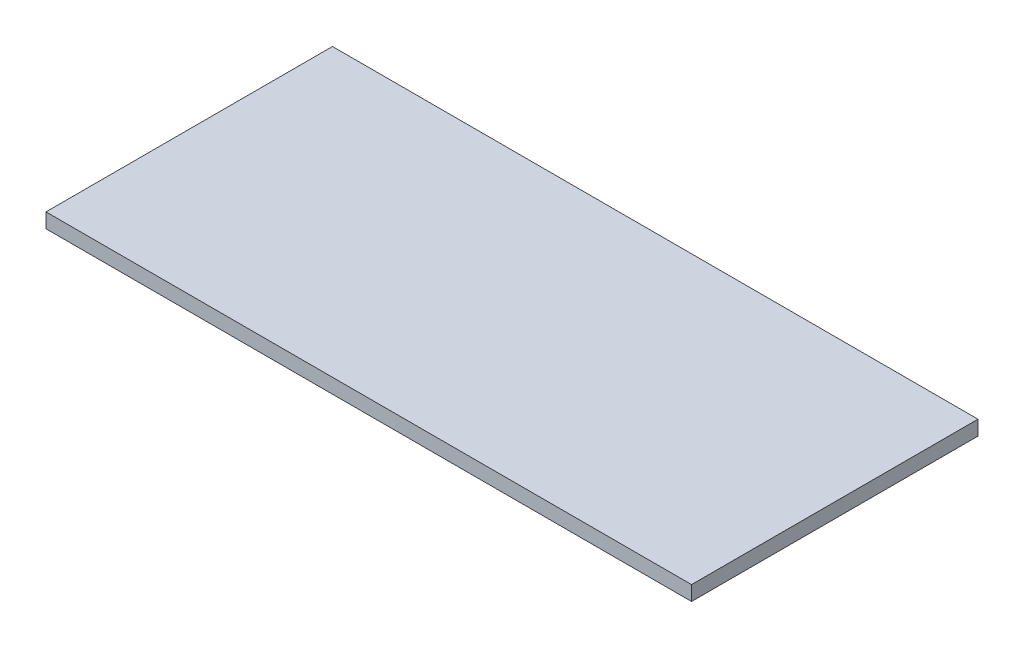
ISO-10303-21;
HEADER;
FILE_DESCRIPTION(('STEP AP214'),'2;1');
FILE_NAME('part.step','',(''),(''),'','','');
FILE_SCHEMA(('AUTOMOTIVE_DESIGN { 1 0 10303 214 1 1 1 1 }'));
ENDSEC;
DATA;
#1=APPLICATION_CONTEXT('core data for automotive mechanical design processes');
#2=APPLICATION_PROTOCOL_DEFINITION('international standard','automotive_design',2000,#1);
#3=PRODUCT_CONTEXT('',#1,'mechanical');
#4=PRODUCT('Part','Part','',(#3));
#5=PRODUCT_RELATED_PRODUCT_CATEGORY('part','',(#4));
#6=PRODUCT_DEFINITION_FORMATION('','',#4);
#7=PRODUCT_DEFINITION_CONTEXT('part definition',#1,'design');
#8=PRODUCT_DEFINITION('design','',#6,#7);
#9=PRODUCT_DEFINITION_SHAPE('','',#8);
#10=(LENGTH_UNIT() NAMED_UNIT(*) SI_UNIT(.MILLI.,.METRE.));
#11=(NAMED_UNIT(*) PLANE_ANGLE_UNIT() SI_UNIT($,.RADIAN.));
#12=(NAMED_UNIT(*) SI_UNIT($,.STERADIAN.) SOLID_ANGLE_UNIT());
#13=UNCERTAINTY_MEASURE_WITH_UNIT(LENGTH_MEASURE(1.E-05),#10,'distance_accuracy_value','');
#14=(GEOMETRIC_REPRESENTATION_CONTEXT(3) GLOBAL_UNCERTAINTY_ASSIGNED_CONTEXT((#13)) GLOBAL_UNIT_ASSIGNED_CONTEXT((#10,
#11,#12)) REPRESENTATION_CONTEXT('',''));
#15=CARTESIAN_POINT('',(0.,0.,0.));
#16=DIRECTION('',(0.,0.,1.));
#17=DIRECTION('',(1.,0.,0.));
#18=AXIS2_PLACEMENT_3D('',#15,#16,#17);
#19=CARTESIAN_POINT('',(44.,2.,-19.525));
#20=DIRECTION('',(-1.,0.,0.));
#21=DIRECTION('',(0.,0.,1.));
#22=AXIS2_PLACEMENT_3D('',#19,#20,#21);
#23=PLANE('',#22);
#24=DIRECTION('',(0.,0.,-1.));
#25=VECTOR('',#24,1.);
#26=CARTESIAN_POINT('',(44.,0.,-19.525));
#27=LINE('',#26,#25);
#28=CARTESIAN_POINT('',(44.,0.,19.525));
#29=VERTEX_POINT('',#28);
#30=CARTESIAN_POINT('',(44.,0.,-19.525));
#31=VERTEX_POINT('',#30);
#32=EDGE_CURVE('E107',#29,#31,#27,.T.);
#33=ORIENTED_EDGE('',*,*,#32,.T.);
#34=DIRECTION('',(0.,-1.,0.));
#35=VECTOR('',#34,1.);
#36=CARTESIAN_POINT('',(44.,2.,-19.525));
#37=LINE('',#36,#35);
#38=CARTESIAN_POINT('',(44.,2.,-19.525));
#39=VERTEX_POINT('',#38);
#40=EDGE_CURVE('E11',#39,#31,#37,.T.);
#41=ORIENTED_EDGE('',*,*,#40,.F.);
#42=DIRECTION('',(0.,0.,-1.));
#43=VECTOR('',#42,1.);
#44=CARTESIAN_POINT('',(44.,2.,-19.525));
#45=LINE('',#44,#43);
#46=CARTESIAN_POINT('',(44.,2.,19.525));
#47=VERTEX_POINT('',#46);
#48=EDGE_CURVE('E91',#47,#39,#45,.T.);
#49=ORIENTED_EDGE('',*,*,#48,.F.);
#50=DIRECTION('',(0.,-1.,0.));
#51=VECTOR('',#50,1.);
#52=CARTESIAN_POINT('',(44.,2.,19.525));
#53=LINE('',#52,#51);
#54=EDGE_CURVE('E103',#47,#29,#53,.T.);
#55=ORIENTED_EDGE('',*,*,#54,.T.);
#56=EDGE_LOOP('',(#33,#41,#49,#55));
#57=FACE_BOUND('',#56,.T.);
#58=ADVANCED_FACE('F39',(#57),#23,.F.);
#59=CARTESIAN_POINT('',(-44.,2.,-19.525));
#60=DIRECTION('',(0.,0.,1.));
#61=DIRECTION('',(1.,0.,0.));
#62=AXIS2_PLACEMENT_3D('',#59,#60,#61);
#63=PLANE('',#62);
#64=DIRECTION('',(-1.,0.,0.));
#65=VECTOR('',#64,1.);
#66=CARTESIAN_POINT('',(-44.,0.,-19.525));
#67=LINE('',#66,#65);
#68=CARTESIAN_POINT('',(-44.,0.,-19.525));
#69=VERTEX_POINT('',#68);
#70=EDGE_CURVE('E96',#31,#69,#67,.T.);
#71=ORIENTED_EDGE('',*,*,#70,.T.);
#72=DIRECTION('',(0.,-1.,0.));
#73=VECTOR('',#72,1.);
#74=CARTESIAN_POINT('',(-44.,2.,-19.525));
#75=LINE('',#74,#73);
#76=CARTESIAN_POINT('',(-44.,2.,-19.525));
#77=VERTEX_POINT('',#76);
#78=EDGE_CURVE('E48',#77,#69,#75,.T.);
#79=ORIENTED_EDGE('',*,*,#78,.F.);
#80=DIRECTION('',(-1.,0.,0.));
#81=VECTOR('',#80,1.);
#82=CARTESIAN_POINT('',(-44.,2.,-19.525));
#83=LINE('',#82,#81);
#84=EDGE_CURVE('E86',#39,#77,#83,.T.);
#85=ORIENTED_EDGE('',*,*,#84,.F.);
#86=ORIENTED_EDGE('',*,*,#40,.T.);
#87=EDGE_LOOP('',(#71,#79,#85,#86));
#88=FACE_BOUND('',#87,.T.);
#89=ADVANCED_FACE('F95',(#88),#63,.F.);
#90=CARTESIAN_POINT('',(-44.,2.,-19.525));
#91=DIRECTION('',(1.,0.,0.));
#92=DIRECTION('',(0.,0.,-1.));
#93=AXIS2_PLACEMENT_3D('',#90,#91,#92);
#94=PLANE('',#93);
#95=DIRECTION('',(0.,0.,1.));
#96=VECTOR('',#95,1.);
#97=CARTESIAN_POINT('',(-44.,0.,-19.525));
#98=LINE('',#97,#96);
#99=CARTESIAN_POINT('',(-44.,0.,19.525));
#100=VERTEX_POINT('',#99);
#101=EDGE_CURVE('E73',#69,#100,#98,.T.);
#102=ORIENTED_EDGE('',*,*,#101,.T.);
#103=DIRECTION('',(0.,-1.,0.));
#104=VECTOR('',#103,1.);
#105=CARTESIAN_POINT('',(-44.,2.,19.525));
#106=LINE('',#105,#104);
#107=CARTESIAN_POINT('',(-44.,2.,19.525));
#108=VERTEX_POINT('',#107);
#109=EDGE_CURVE('E98',#108,#100,#106,.T.);
#110=ORIENTED_EDGE('',*,*,#109,.F.);
#111=DIRECTION('',(0.,0.,1.));
#112=VECTOR('',#111,1.);
#113=CARTESIAN_POINT('',(-44.,2.,-19.525));
#114=LINE('',#113,#112);
#115=EDGE_CURVE('E89',#77,#108,#114,.T.);
#116=ORIENTED_EDGE('',*,*,#115,.F.);
#117=ORIENTED_EDGE('',*,*,#78,.T.);
#118=EDGE_LOOP('',(#102,#110,#116,#117));
#119=FACE_BOUND('',#118,.T.);
#120=ADVANCED_FACE('F99',(#119),#94,.F.);
#121=CARTESIAN_POINT('',(-44.,2.,19.525));
#122=DIRECTION('',(0.,0.,-1.));
#123=DIRECTION('',(-1.,0.,0.));
#124=AXIS2_PLACEMENT_3D('',#121,#122,#123);
#125=PLANE('',#124);
#126=DIRECTION('',(1.,0.,0.));
#127=VECTOR('',#126,1.);
#128=CARTESIAN_POINT('',(-44.,0.,19.525));
#129=LINE('',#128,#127);
#130=EDGE_CURVE('E79',#100,#29,#129,.T.);
#131=ORIENTED_EDGE('',*,*,#130,.T.);
#132=ORIENTED_EDGE('',*,*,#54,.F.);
#133=DIRECTION('',(1.,0.,0.));
#134=VECTOR('',#133,1.);
#135=CARTESIAN_POINT('',(-44.,2.,19.525));
#136=LINE('',#135,#134);
#137=EDGE_CURVE('E56',#108,#47,#136,.T.);
#138=ORIENTED_EDGE('',*,*,#137,.F.);
#139=ORIENTED_EDGE('',*,*,#109,.T.);
#140=EDGE_LOOP('',(#131,#132,#138,#139));
#141=FACE_BOUND('',#140,.T.);
#142=ADVANCED_FACE('F120',(#141),#125,.F.);
#143=CARTESIAN_POINT('',(0.,2.,0.));
#144=DIRECTION('',(0.,1.,0.));
#145=DIRECTION('',(0.,0.,1.));
#146=AXIS2_PLACEMENT_3D('',#143,#144,#145);
#147=PLANE('',#146);
#148=ORIENTED_EDGE('',*,*,#48,.T.);
#149=ORIENTED_EDGE('',*,*,#84,.T.);
#150=ORIENTED_EDGE('',*,*,#115,.T.);
#151=ORIENTED_EDGE('',*,*,#137,.T.);
#152=EDGE_LOOP('',(#148,#149,#150,#151));
#153=FACE_BOUND('',#152,.T.);
#154=ADVANCED_FACE('F87',(#153),#147,.T.);
#155=CARTESIAN_POINT('',(0.,0.,0.));
#156=DIRECTION('',(0.,1.,0.));
#157=DIRECTION('',(0.,0.,1.));
#158=AXIS2_PLACEMENT_3D('',#155,#156,#157);
#159=PLANE('',#158);
#160=ORIENTED_EDGE('',*,*,#32,.F.);
#161=ORIENTED_EDGE('',*,*,#130,.F.);
#162=ORIENTED_EDGE('',*,*,#101,.F.);
#163=ORIENTED_EDGE('',*,*,#70,.F.);
#164=EDGE_LOOP('',(#160,#161,#162,#163));
#165=FACE_BOUND('',#164,.T.);
#166=ADVANCED_FACE('F123',(#165),#159,.F.);
#167=CLOSED_SHELL('',(#58,#89,#120,#142,#154,#166));
#168=MANIFOLD_SOLID_BREP('B2',#167);
#169=ADVANCED_BREP_SHAPE_REPRESENTATION('',(#18,#168),#14);
#170=SHAPE_DEFINITION_REPRESENTATION(#9,#169);
ENDSEC;
END-ISO-10303-21;
